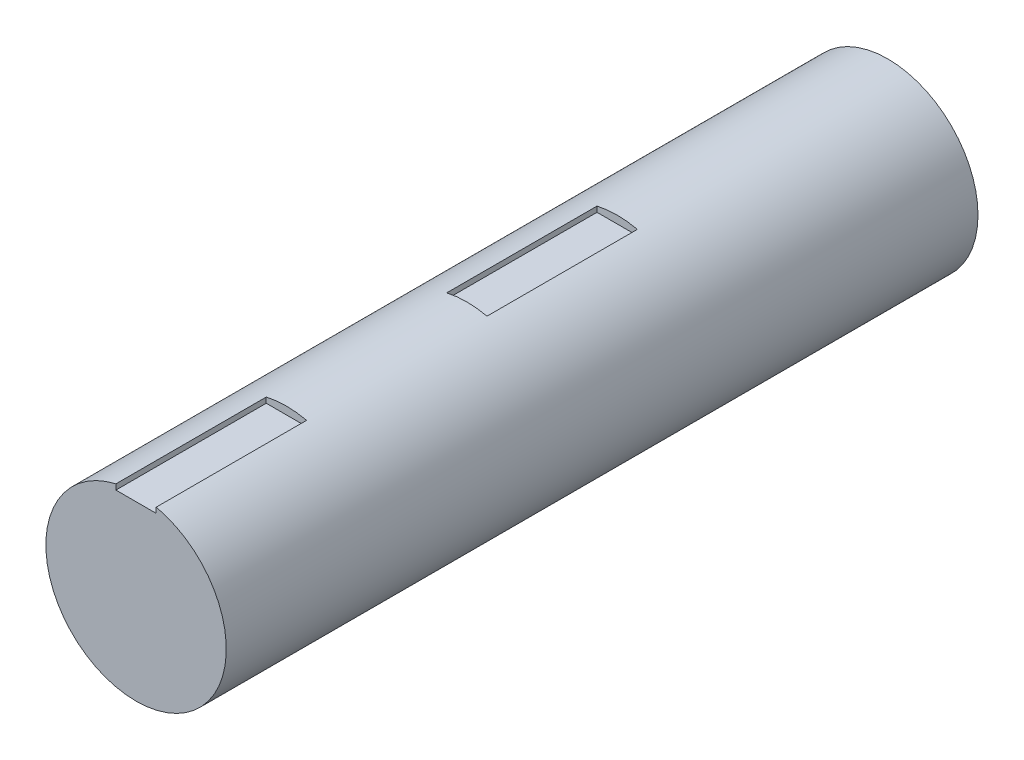
ISO-10303-21;
HEADER;
FILE_DESCRIPTION(('STEP AP214'),'2;1');
FILE_NAME('part.step','',(''),(''),'','','');
FILE_SCHEMA(('AUTOMOTIVE_DESIGN { 1 0 10303 214 1 1 1 1 }'));
ENDSEC;
DATA;
#1=APPLICATION_CONTEXT('core data for automotive mechanical design processes');
#2=APPLICATION_PROTOCOL_DEFINITION('international standard','automotive_design',2000,#1);
#3=PRODUCT_CONTEXT('',#1,'mechanical');
#4=PRODUCT('Part','Part','',(#3));
#5=PRODUCT_RELATED_PRODUCT_CATEGORY('part','',(#4));
#6=PRODUCT_DEFINITION_FORMATION('','',#4);
#7=PRODUCT_DEFINITION_CONTEXT('part definition',#1,'design');
#8=PRODUCT_DEFINITION('design','',#6,#7);
#9=PRODUCT_DEFINITION_SHAPE('','',#8);
#10=(LENGTH_UNIT() NAMED_UNIT(*) SI_UNIT(.MILLI.,.METRE.));
#11=(NAMED_UNIT(*) PLANE_ANGLE_UNIT() SI_UNIT($,.RADIAN.));
#12=(NAMED_UNIT(*) SI_UNIT($,.STERADIAN.) SOLID_ANGLE_UNIT());
#13=UNCERTAINTY_MEASURE_WITH_UNIT(LENGTH_MEASURE(1.E-05),#10,'distance_accuracy_value','');
#14=(GEOMETRIC_REPRESENTATION_CONTEXT(3) GLOBAL_UNCERTAINTY_ASSIGNED_CONTEXT((#13)) GLOBAL_UNIT_ASSIGNED_CONTEXT((#10,
#11,#12)) REPRESENTATION_CONTEXT('',''));
#15=CARTESIAN_POINT('',(0.,0.,0.));
#16=DIRECTION('',(0.,0.,1.));
#17=DIRECTION('',(1.,0.,0.));
#18=AXIS2_PLACEMENT_3D('',#15,#16,#17);
#19=CARTESIAN_POINT('',(0.,0.,125.));
#20=DIRECTION('',(0.,0.,-1.));
#21=DIRECTION('',(-1.,0.,0.));
#22=AXIS2_PLACEMENT_3D('',#19,#20,#21);
#23=CYLINDRICAL_SURFACE('',#22,30.);
#24=CARTESIAN_POINT('',(0.,0.,-125.));
#25=DIRECTION('',(0.,0.,1.));
#26=DIRECTION('',(1.,0.,0.));
#27=AXIS2_PLACEMENT_3D('',#24,#25,#26);
#28=CIRCLE('',#27,30.);
#29=CARTESIAN_POINT('',(30.,0.,-125.));
#30=VERTEX_POINT('',#29);
#31=EDGE_CURVE('E148',#30,#30,#28,.T.);
#32=ORIENTED_EDGE('',*,*,#31,.T.);
#33=EDGE_LOOP('',(#32));
#34=FACE_BOUND('',#33,.T.);
#35=CARTESIAN_POINT('',(0.,0.,75.));
#36=DIRECTION('',(0.,0.,1.));
#37=DIRECTION('',(1.,0.,0.));
#38=AXIS2_PLACEMENT_3D('',#35,#36,#37);
#39=CIRCLE('',#38,30.);
#40=CARTESIAN_POINT('',(6.70976229208975,29.2400254785055,75.));
#41=VERTEX_POINT('',#40);
#42=CARTESIAN_POINT('',(-6.70976229208975,29.2400254785055,75.));
#43=VERTEX_POINT('',#42);
#44=EDGE_CURVE('E156',#41,#43,#39,.T.);
#45=ORIENTED_EDGE('',*,*,#44,.F.);
#46=DIRECTION('',(0.,0.,-1.));
#47=VECTOR('',#46,1.);
#48=CARTESIAN_POINT('',(6.70976229208975,29.2400254785055,125.));
#49=LINE('',#48,#47);
#50=CARTESIAN_POINT('',(6.70976229208975,29.2400254785055,125.));
#51=VERTEX_POINT('',#50);
#52=EDGE_CURVE('E145',#41,#51,#49,.F.);
#53=ORIENTED_EDGE('',*,*,#52,.T.);
#54=CARTESIAN_POINT('',(0.,0.,125.));
#55=DIRECTION('',(0.,0.,1.));
#56=DIRECTION('',(1.,0.,0.));
#57=AXIS2_PLACEMENT_3D('',#54,#55,#56);
#58=CIRCLE('',#57,30.);
#59=CARTESIAN_POINT('',(-6.70976229208975,29.2400254785055,125.));
#60=VERTEX_POINT('',#59);
#61=EDGE_CURVE('E149',#60,#51,#58,.T.);
#62=ORIENTED_EDGE('',*,*,#61,.F.);
#63=DIRECTION('',(0.,0.,-1.));
#64=VECTOR('',#63,1.);
#65=CARTESIAN_POINT('',(-6.70976229208975,29.2400254785055,125.));
#66=LINE('',#65,#64);
#67=EDGE_CURVE('E54',#60,#43,#66,.T.);
#68=ORIENTED_EDGE('',*,*,#67,.T.);
#69=EDGE_LOOP('',(#45,#53,#62,#68));
#70=FACE_BOUND('',#69,.T.);
#71=CARTESIAN_POINT('',(0.,0.,-35.));
#72=DIRECTION('',(0.,0.,1.));
#73=DIRECTION('',(1.,0.,0.));
#74=AXIS2_PLACEMENT_3D('',#71,#72,#73);
#75=CIRCLE('',#74,30.);
#76=CARTESIAN_POINT('',(6.70976229208975,29.2400254785055,-35.));
#77=VERTEX_POINT('',#76);
#78=CARTESIAN_POINT('',(-6.70976229208975,29.2400254785055,-35.));
#79=VERTEX_POINT('',#78);
#80=EDGE_CURVE('E11',#77,#79,#75,.T.);
#81=ORIENTED_EDGE('',*,*,#80,.F.);
#82=DIRECTION('',(0.,0.,-1.));
#83=VECTOR('',#82,1.);
#84=CARTESIAN_POINT('',(6.70976229208975,29.2400254785055,125.));
#85=LINE('',#84,#83);
#86=CARTESIAN_POINT('',(6.70976229208975,29.2400254785055,15.));
#87=VERTEX_POINT('',#86);
#88=EDGE_CURVE('E161',#77,#87,#85,.F.);
#89=ORIENTED_EDGE('',*,*,#88,.T.);
#90=CARTESIAN_POINT('',(0.,0.,15.));
#91=DIRECTION('',(0.,0.,1.));
#92=DIRECTION('',(1.,0.,0.));
#93=AXIS2_PLACEMENT_3D('',#90,#91,#92);
#94=CIRCLE('',#93,30.);
#95=CARTESIAN_POINT('',(-6.70976229208975,29.2400254785055,15.));
#96=VERTEX_POINT('',#95);
#97=EDGE_CURVE('E158',#87,#96,#94,.T.);
#98=ORIENTED_EDGE('',*,*,#97,.T.);
#99=DIRECTION('',(0.,0.,-1.));
#100=VECTOR('',#99,1.);
#101=CARTESIAN_POINT('',(-6.70976229208975,29.2400254785055,125.));
#102=LINE('',#101,#100);
#103=EDGE_CURVE('E39',#96,#79,#102,.T.);
#104=ORIENTED_EDGE('',*,*,#103,.T.);
#105=EDGE_LOOP('',(#81,#89,#98,#104));
#106=FACE_BOUND('',#105,.T.);
#107=ADVANCED_FACE('F32',(#34,#70,#106),#23,.T.);
#108=CARTESIAN_POINT('',(0.,0.,125.));
#109=DIRECTION('',(0.,0.,1.));
#110=DIRECTION('',(1.,0.,0.));
#111=AXIS2_PLACEMENT_3D('',#108,#109,#110);
#112=PLANE('',#111);
#113=DIRECTION('',(0.,1.,0.));
#114=VECTOR('',#113,1.);
#115=CARTESIAN_POINT('',(6.70976229208975,34.44,125.));
#116=LINE('',#115,#114);
#117=CARTESIAN_POINT('',(6.70976229208975,27.44,125.));
#118=VERTEX_POINT('',#117);
#119=EDGE_CURVE('E125',#118,#51,#116,.T.);
#120=ORIENTED_EDGE('',*,*,#119,.F.);
#121=DIRECTION('',(1.,0.,0.));
#122=VECTOR('',#121,1.);
#123=CARTESIAN_POINT('',(-6.70976229208975,27.44,125.));
#124=LINE('',#123,#122);
#125=CARTESIAN_POINT('',(-6.70976229208975,27.44,125.));
#126=VERTEX_POINT('',#125);
#127=EDGE_CURVE('E131',#126,#118,#124,.T.);
#128=ORIENTED_EDGE('',*,*,#127,.F.);
#129=DIRECTION('',(0.,-1.,0.));
#130=VECTOR('',#129,1.);
#131=CARTESIAN_POINT('',(-6.70976229208975,0.,125.));
#132=LINE('',#131,#130);
#133=EDGE_CURVE('E152',#60,#126,#132,.T.);
#134=ORIENTED_EDGE('',*,*,#133,.F.);
#135=ORIENTED_EDGE('',*,*,#61,.T.);
#136=EDGE_LOOP('',(#120,#128,#134,#135));
#137=FACE_BOUND('',#136,.T.);
#138=ADVANCED_FACE('F180',(#137),#112,.T.);
#139=CARTESIAN_POINT('',(0.,0.,-125.));
#140=DIRECTION('',(0.,0.,1.));
#141=DIRECTION('',(1.,0.,0.));
#142=AXIS2_PLACEMENT_3D('',#139,#140,#141);
#143=PLANE('',#142);
#144=ORIENTED_EDGE('',*,*,#31,.F.);
#145=EDGE_LOOP('',(#144));
#146=FACE_BOUND('',#145,.T.);
#147=ADVANCED_FACE('F185',(#146),#143,.F.);
#148=CARTESIAN_POINT('',(0.,0.,75.));
#149=DIRECTION('',(0.,0.,1.));
#150=DIRECTION('',(1.,0.,0.));
#151=AXIS2_PLACEMENT_3D('',#148,#149,#150);
#152=PLANE('',#151);
#153=ORIENTED_EDGE('',*,*,#44,.T.);
#154=DIRECTION('',(0.,-1.,0.));
#155=VECTOR('',#154,1.);
#156=CARTESIAN_POINT('',(-6.70976229208975,34.44,75.));
#157=LINE('',#156,#155);
#158=CARTESIAN_POINT('',(-6.70976229208975,27.44,75.));
#159=VERTEX_POINT('',#158);
#160=EDGE_CURVE('E130',#43,#159,#157,.T.);
#161=ORIENTED_EDGE('',*,*,#160,.T.);
#162=DIRECTION('',(1.,0.,0.));
#163=VECTOR('',#162,1.);
#164=CARTESIAN_POINT('',(-6.70976229208975,27.44,75.));
#165=LINE('',#164,#163);
#166=CARTESIAN_POINT('',(6.70976229208975,27.44,75.));
#167=VERTEX_POINT('',#166);
#168=EDGE_CURVE('E133',#159,#167,#165,.T.);
#169=ORIENTED_EDGE('',*,*,#168,.T.);
#170=DIRECTION('',(0.,1.,0.));
#171=VECTOR('',#170,1.);
#172=CARTESIAN_POINT('',(6.70976229208975,34.44,75.));
#173=LINE('',#172,#171);
#174=EDGE_CURVE('E127',#167,#41,#173,.T.);
#175=ORIENTED_EDGE('',*,*,#174,.T.);
#176=EDGE_LOOP('',(#153,#161,#169,#175));
#177=FACE_BOUND('',#176,.T.);
#178=ADVANCED_FACE('F193',(#177),#152,.T.);
#179=CARTESIAN_POINT('',(6.70976229208975,34.44,75.));
#180=DIRECTION('',(1.,0.,0.));
#181=DIRECTION('',(0.,0.,-1.));
#182=AXIS2_PLACEMENT_3D('',#179,#180,#181);
#183=PLANE('',#182);
#184=ORIENTED_EDGE('',*,*,#174,.F.);
#185=DIRECTION('',(0.,0.,1.));
#186=VECTOR('',#185,1.);
#187=CARTESIAN_POINT('',(6.70976229208975,27.44,75.));
#188=LINE('',#187,#186);
#189=EDGE_CURVE('E140',#167,#118,#188,.T.);
#190=ORIENTED_EDGE('',*,*,#189,.T.);
#191=ORIENTED_EDGE('',*,*,#119,.T.);
#192=ORIENTED_EDGE('',*,*,#52,.F.);
#193=EDGE_LOOP('',(#184,#190,#191,#192));
#194=FACE_BOUND('',#193,.T.);
#195=ADVANCED_FACE('F202',(#194),#183,.F.);
#196=CARTESIAN_POINT('',(-6.70976229208975,34.44,75.));
#197=DIRECTION('',(-1.,0.,0.));
#198=DIRECTION('',(0.,0.,1.));
#199=AXIS2_PLACEMENT_3D('',#196,#197,#198);
#200=PLANE('',#199);
#201=ORIENTED_EDGE('',*,*,#133,.T.);
#202=DIRECTION('',(0.,0.,1.));
#203=VECTOR('',#202,1.);
#204=CARTESIAN_POINT('',(-6.70976229208975,27.44,75.));
#205=LINE('',#204,#203);
#206=EDGE_CURVE('E136',#159,#126,#205,.T.);
#207=ORIENTED_EDGE('',*,*,#206,.F.);
#208=ORIENTED_EDGE('',*,*,#160,.F.);
#209=ORIENTED_EDGE('',*,*,#67,.F.);
#210=EDGE_LOOP('',(#201,#207,#208,#209));
#211=FACE_BOUND('',#210,.T.);
#212=ADVANCED_FACE('F196',(#211),#200,.F.);
#213=CARTESIAN_POINT('',(-6.70976229208975,27.44,75.));
#214=DIRECTION('',(0.,-1.,0.));
#215=DIRECTION('',(0.,0.,-1.));
#216=AXIS2_PLACEMENT_3D('',#213,#214,#215);
#217=PLANE('',#216);
#218=ORIENTED_EDGE('',*,*,#127,.T.);
#219=ORIENTED_EDGE('',*,*,#189,.F.);
#220=ORIENTED_EDGE('',*,*,#168,.F.);
#221=ORIENTED_EDGE('',*,*,#206,.T.);
#222=EDGE_LOOP('',(#218,#219,#220,#221));
#223=FACE_BOUND('',#222,.T.);
#224=ADVANCED_FACE('F175',(#223),#217,.F.);
#225=CARTESIAN_POINT('',(-6.70976229208975,34.44,-35.));
#226=DIRECTION('',(-1.,0.,0.));
#227=DIRECTION('',(0.,0.,1.));
#228=AXIS2_PLACEMENT_3D('',#225,#226,#227);
#229=PLANE('',#228);
#230=DIRECTION('',(0.,-1.,0.));
#231=VECTOR('',#230,1.);
#232=CARTESIAN_POINT('',(-6.70976229208975,34.44,15.));
#233=LINE('',#232,#231);
#234=CARTESIAN_POINT('',(-6.70976229208975,27.44,15.));
#235=VERTEX_POINT('',#234);
#236=EDGE_CURVE('E46',#96,#235,#233,.T.);
#237=ORIENTED_EDGE('',*,*,#236,.T.);
#238=DIRECTION('',(0.,0.,1.));
#239=VECTOR('',#238,1.);
#240=CARTESIAN_POINT('',(-6.70976229208975,27.44,-35.));
#241=LINE('',#240,#239);
#242=CARTESIAN_POINT('',(-6.70976229208975,27.44,-35.));
#243=VERTEX_POINT('',#242);
#244=EDGE_CURVE('E108',#243,#235,#241,.T.);
#245=ORIENTED_EDGE('',*,*,#244,.F.);
#246=DIRECTION('',(0.,-1.,0.));
#247=VECTOR('',#246,1.);
#248=CARTESIAN_POINT('',(-6.70976229208975,34.44,-35.));
#249=LINE('',#248,#247);
#250=EDGE_CURVE('E96',#79,#243,#249,.T.);
#251=ORIENTED_EDGE('',*,*,#250,.F.);
#252=ORIENTED_EDGE('',*,*,#103,.F.);
#253=EDGE_LOOP('',(#237,#245,#251,#252));
#254=FACE_BOUND('',#253,.T.);
#255=ADVANCED_FACE('F109',(#254),#229,.F.);
#256=CARTESIAN_POINT('',(6.70976229208975,27.44,-35.));
#257=DIRECTION('',(1.,0.,0.));
#258=DIRECTION('',(0.,0.,-1.));
#259=AXIS2_PLACEMENT_3D('',#256,#257,#258);
#260=PLANE('',#259);
#261=DIRECTION('',(0.,1.,0.));
#262=VECTOR('',#261,1.);
#263=CARTESIAN_POINT('',(6.70976229208975,27.44,-35.));
#264=LINE('',#263,#262);
#265=CARTESIAN_POINT('',(6.70976229208975,27.44,-35.));
#266=VERTEX_POINT('',#265);
#267=EDGE_CURVE('E113',#266,#77,#264,.T.);
#268=ORIENTED_EDGE('',*,*,#267,.F.);
#269=DIRECTION('',(0.,0.,1.));
#270=VECTOR('',#269,1.);
#271=CARTESIAN_POINT('',(6.70976229208975,27.44,-35.));
#272=LINE('',#271,#270);
#273=CARTESIAN_POINT('',(6.70976229208975,27.44,15.));
#274=VERTEX_POINT('',#273);
#275=EDGE_CURVE('E112',#266,#274,#272,.T.);
#276=ORIENTED_EDGE('',*,*,#275,.T.);
#277=DIRECTION('',(0.,1.,0.));
#278=VECTOR('',#277,1.);
#279=CARTESIAN_POINT('',(6.70976229208975,27.44,15.));
#280=LINE('',#279,#278);
#281=EDGE_CURVE('E105',#274,#87,#280,.T.);
#282=ORIENTED_EDGE('',*,*,#281,.T.);
#283=ORIENTED_EDGE('',*,*,#88,.F.);
#284=EDGE_LOOP('',(#268,#276,#282,#283));
#285=FACE_BOUND('',#284,.T.);
#286=ADVANCED_FACE('F167',(#285),#260,.F.);
#287=CARTESIAN_POINT('',(0.,0.,-35.));
#288=DIRECTION('',(0.,0.,1.));
#289=DIRECTION('',(1.,0.,0.));
#290=AXIS2_PLACEMENT_3D('',#287,#288,#289);
#291=PLANE('',#290);
#292=ORIENTED_EDGE('',*,*,#80,.T.);
#293=ORIENTED_EDGE('',*,*,#250,.T.);
#294=DIRECTION('',(1.,0.,0.));
#295=VECTOR('',#294,1.);
#296=CARTESIAN_POINT('',(-6.70976229208975,27.44,-35.));
#297=LINE('',#296,#295);
#298=EDGE_CURVE('E101',#243,#266,#297,.T.);
#299=ORIENTED_EDGE('',*,*,#298,.T.);
#300=ORIENTED_EDGE('',*,*,#267,.T.);
#301=EDGE_LOOP('',(#292,#293,#299,#300));
#302=FACE_BOUND('',#301,.T.);
#303=ADVANCED_FACE('F98',(#302),#291,.T.);
#304=CARTESIAN_POINT('',(0.,0.,15.));
#305=DIRECTION('',(0.,0.,1.));
#306=DIRECTION('',(1.,0.,0.));
#307=AXIS2_PLACEMENT_3D('',#304,#305,#306);
#308=PLANE('',#307);
#309=ORIENTED_EDGE('',*,*,#281,.F.);
#310=DIRECTION('',(1.,0.,0.));
#311=VECTOR('',#310,1.);
#312=CARTESIAN_POINT('',(-6.70976229208975,27.44,15.));
#313=LINE('',#312,#311);
#314=EDGE_CURVE('E121',#235,#274,#313,.T.);
#315=ORIENTED_EDGE('',*,*,#314,.F.);
#316=ORIENTED_EDGE('',*,*,#236,.F.);
#317=ORIENTED_EDGE('',*,*,#97,.F.);
#318=EDGE_LOOP('',(#309,#315,#316,#317));
#319=FACE_BOUND('',#318,.T.);
#320=ADVANCED_FACE('F165',(#319),#308,.F.);
#321=CARTESIAN_POINT('',(-6.70976229208975,27.44,-35.));
#322=DIRECTION('',(0.,-1.,0.));
#323=DIRECTION('',(0.,0.,-1.));
#324=AXIS2_PLACEMENT_3D('',#321,#322,#323);
#325=PLANE('',#324);
#326=ORIENTED_EDGE('',*,*,#314,.T.);
#327=ORIENTED_EDGE('',*,*,#275,.F.);
#328=ORIENTED_EDGE('',*,*,#298,.F.);
#329=ORIENTED_EDGE('',*,*,#244,.T.);
#330=EDGE_LOOP('',(#326,#327,#328,#329));
#331=FACE_BOUND('',#330,.T.);
#332=ADVANCED_FACE('F115',(#331),#325,.F.);
#333=CLOSED_SHELL('',(#107,#138,#147,#178,#195,#212,#224,#255,#286,#303,#320,#332));
#334=MANIFOLD_SOLID_BREP('B2',#333);
#335=ADVANCED_BREP_SHAPE_REPRESENTATION('',(#18,#334),#14);
#336=SHAPE_DEFINITION_REPRESENTATION(#9,#335);
ENDSEC;
END-ISO-10303-21;
